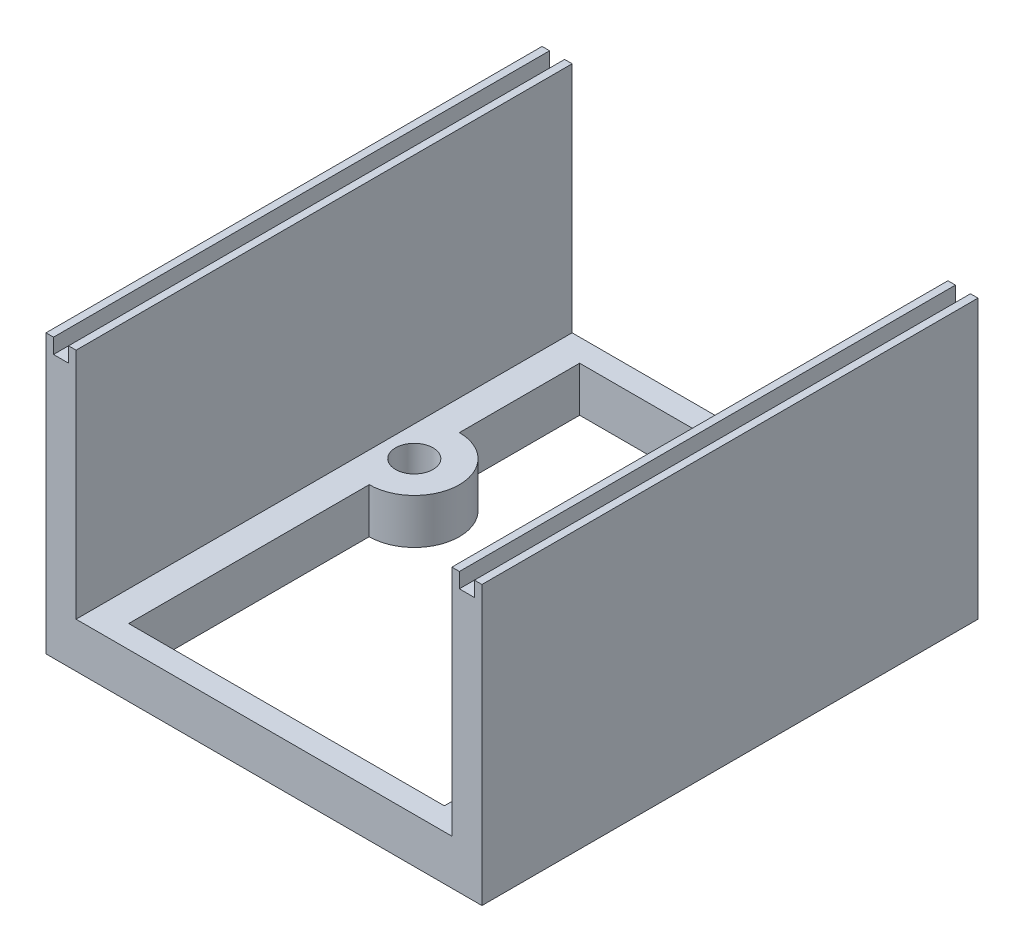
ISO-10303-21;
HEADER;
FILE_DESCRIPTION(('STEP AP214'),'2;1');
FILE_NAME('part.step','',(''),(''),'','','');
FILE_SCHEMA(('AUTOMOTIVE_DESIGN { 1 0 10303 214 1 1 1 1 }'));
ENDSEC;
DATA;
#1=APPLICATION_CONTEXT('core data for automotive mechanical design processes');
#2=APPLICATION_PROTOCOL_DEFINITION('international standard','automotive_design',2000,#1);
#3=PRODUCT_CONTEXT('',#1,'mechanical');
#4=PRODUCT('Part','Part','',(#3));
#5=PRODUCT_RELATED_PRODUCT_CATEGORY('part','',(#4));
#6=PRODUCT_DEFINITION_FORMATION('','',#4);
#7=PRODUCT_DEFINITION_CONTEXT('part definition',#1,'design');
#8=PRODUCT_DEFINITION('design','',#6,#7);
#9=PRODUCT_DEFINITION_SHAPE('','',#8);
#10=(LENGTH_UNIT() NAMED_UNIT(*) SI_UNIT(.MILLI.,.METRE.));
#11=(NAMED_UNIT(*) PLANE_ANGLE_UNIT() SI_UNIT($,.RADIAN.));
#12=(NAMED_UNIT(*) SI_UNIT($,.STERADIAN.) SOLID_ANGLE_UNIT());
#13=UNCERTAINTY_MEASURE_WITH_UNIT(LENGTH_MEASURE(1.E-05),#10,'distance_accuracy_value','');
#14=(GEOMETRIC_REPRESENTATION_CONTEXT(3) GLOBAL_UNCERTAINTY_ASSIGNED_CONTEXT((#13)) GLOBAL_UNIT_ASSIGNED_CONTEXT((#10,
#11,#12)) REPRESENTATION_CONTEXT('',''));
#15=CARTESIAN_POINT('',(0.,0.,0.));
#16=DIRECTION('',(0.,0.,1.));
#17=DIRECTION('',(1.,0.,0.));
#18=AXIS2_PLACEMENT_3D('',#15,#16,#17);
#19=CARTESIAN_POINT('',(0.,18.5,0.));
#20=DIRECTION('',(0.,1.,0.));
#21=DIRECTION('',(0.,0.,1.));
#22=AXIS2_PLACEMENT_3D('',#19,#20,#21);
#23=PLANE('',#22);
#24=DIRECTION('',(0.,0.,1.));
#25=VECTOR('',#24,1.);
#26=CARTESIAN_POINT('',(13.,18.5,-16.5));
#27=LINE('',#26,#25);
#28=CARTESIAN_POINT('',(13.,18.5,-16.5));
#29=VERTEX_POINT('',#28);
#30=CARTESIAN_POINT('',(13.,18.5,16.5));
#31=VERTEX_POINT('',#30);
#32=EDGE_CURVE('E213',#29,#31,#27,.T.);
#33=ORIENTED_EDGE('',*,*,#32,.F.);
#34=DIRECTION('',(-1.,0.,0.));
#35=VECTOR('',#34,1.);
#36=CARTESIAN_POINT('',(14.5,18.5,-16.5));
#37=LINE('',#36,#35);
#38=CARTESIAN_POINT('',(12.5,18.5,-16.5));
#39=VERTEX_POINT('',#38);
#40=EDGE_CURVE('E339',#29,#39,#37,.T.);
#41=ORIENTED_EDGE('',*,*,#40,.T.);
#42=DIRECTION('',(0.,0.,1.));
#43=VECTOR('',#42,1.);
#44=CARTESIAN_POINT('',(12.5,18.5,16.5));
#45=LINE('',#44,#43);
#46=CARTESIAN_POINT('',(12.5,18.5,16.5));
#47=VERTEX_POINT('',#46);
#48=EDGE_CURVE('E336',#39,#47,#45,.T.);
#49=ORIENTED_EDGE('',*,*,#48,.T.);
#50=DIRECTION('',(1.,0.,0.));
#51=VECTOR('',#50,1.);
#52=CARTESIAN_POINT('',(14.5,18.5,16.5));
#53=LINE('',#52,#51);
#54=EDGE_CURVE('E333',#47,#31,#53,.T.);
#55=ORIENTED_EDGE('',*,*,#54,.T.);
#56=EDGE_LOOP('',(#33,#41,#49,#55));
#57=FACE_BOUND('',#56,.T.);
#58=ADVANCED_FACE('F45',(#57),#23,.T.);
#59=CARTESIAN_POINT('',(0.,18.5,0.));
#60=DIRECTION('',(0.,1.,0.));
#61=DIRECTION('',(0.,0.,1.));
#62=AXIS2_PLACEMENT_3D('',#59,#60,#61);
#63=PLANE('',#62);
#64=DIRECTION('',(0.,0.,1.));
#65=VECTOR('',#64,1.);
#66=CARTESIAN_POINT('',(-14.,18.5,-16.5));
#67=LINE('',#66,#65);
#68=CARTESIAN_POINT('',(-14.,18.5,-16.5));
#69=VERTEX_POINT('',#68);
#70=CARTESIAN_POINT('',(-14.,18.5,16.5));
#71=VERTEX_POINT('',#70);
#72=EDGE_CURVE('E243',#69,#71,#67,.T.);
#73=ORIENTED_EDGE('',*,*,#72,.F.);
#74=DIRECTION('',(-1.,0.,0.));
#75=VECTOR('',#74,1.);
#76=CARTESIAN_POINT('',(-14.5,18.5,-16.5));
#77=LINE('',#76,#75);
#78=CARTESIAN_POINT('',(-14.5,18.5,-16.5));
#79=VERTEX_POINT('',#78);
#80=EDGE_CURVE('E303',#69,#79,#77,.T.);
#81=ORIENTED_EDGE('',*,*,#80,.T.);
#82=DIRECTION('',(0.,0.,1.));
#83=VECTOR('',#82,1.);
#84=CARTESIAN_POINT('',(-14.5,18.5,-16.5));
#85=LINE('',#84,#83);
#86=CARTESIAN_POINT('',(-14.5,18.5,16.5));
#87=VERTEX_POINT('',#86);
#88=EDGE_CURVE('E290',#79,#87,#85,.T.);
#89=ORIENTED_EDGE('',*,*,#88,.T.);
#90=DIRECTION('',(1.,0.,0.));
#91=VECTOR('',#90,1.);
#92=CARTESIAN_POINT('',(-14.5,18.5,16.5));
#93=LINE('',#92,#91);
#94=EDGE_CURVE('E296',#87,#71,#93,.T.);
#95=ORIENTED_EDGE('',*,*,#94,.T.);
#96=EDGE_LOOP('',(#73,#81,#89,#95));
#97=FACE_BOUND('',#96,.T.);
#98=ADVANCED_FACE('F496',(#97),#63,.T.);
#99=CARTESIAN_POINT('',(0.,3.,0.));
#100=DIRECTION('',(0.,-1.,0.));
#101=DIRECTION('',(0.,0.,-1.));
#102=AXIS2_PLACEMENT_3D('',#99,#100,#101);
#103=PLANE('',#102);
#104=CARTESIAN_POINT('',(-10.5,3.,-4.));
#105=DIRECTION('',(0.,1.,0.));
#106=DIRECTION('',(0.,0.,1.));
#107=AXIS2_PLACEMENT_3D('',#104,#105,#106);
#108=CIRCLE('',#107,1.25);
#109=CARTESIAN_POINT('',(-10.5,3.,-2.75));
#110=VERTEX_POINT('',#109);
#111=EDGE_CURVE('E374',#110,#110,#108,.T.);
#112=ORIENTED_EDGE('',*,*,#111,.F.);
#113=EDGE_LOOP('',(#112));
#114=FACE_BOUND('',#113,.T.);
#115=CARTESIAN_POINT('',(10.5,3.,-4.));
#116=DIRECTION('',(0.,1.,0.));
#117=DIRECTION('',(0.,0.,1.));
#118=AXIS2_PLACEMENT_3D('',#115,#116,#117);
#119=CIRCLE('',#118,1.25);
#120=CARTESIAN_POINT('',(10.5,3.,-2.75));
#121=VERTEX_POINT('',#120);
#122=EDGE_CURVE('E378',#121,#121,#119,.T.);
#123=ORIENTED_EDGE('',*,*,#122,.F.);
#124=EDGE_LOOP('',(#123));
#125=FACE_BOUND('',#124,.T.);
#126=DIRECTION('',(-1.,0.,0.));
#127=VECTOR('',#126,1.);
#128=CARTESIAN_POINT('',(-10.5,3.,-15.));
#129=LINE('',#128,#127);
#130=CARTESIAN_POINT('',(10.5,3.,-15.));
#131=VERTEX_POINT('',#130);
#132=CARTESIAN_POINT('',(-10.5,3.,-15.));
#133=VERTEX_POINT('',#132);
#134=EDGE_CURVE('E385',#131,#133,#129,.T.);
#135=ORIENTED_EDGE('',*,*,#134,.F.);
#136=DIRECTION('',(0.,0.,-1.));
#137=VECTOR('',#136,1.);
#138=CARTESIAN_POINT('',(10.5,3.,-7.));
#139=LINE('',#138,#137);
#140=CARTESIAN_POINT('',(10.5,3.,-7.));
#141=VERTEX_POINT('',#140);
#142=EDGE_CURVE('E408',#141,#131,#139,.T.);
#143=ORIENTED_EDGE('',*,*,#142,.F.);
#144=CARTESIAN_POINT('',(10.5,3.,-4.));
#145=DIRECTION('',(0.,-1.,0.));
#146=DIRECTION('',(0.,0.,1.));
#147=AXIS2_PLACEMENT_3D('',#144,#145,#146);
#148=CIRCLE('',#147,3.);
#149=CARTESIAN_POINT('',(10.5,3.,-0.999999999999999));
#150=VERTEX_POINT('',#149);
#151=EDGE_CURVE('E404',#150,#141,#148,.T.);
#152=ORIENTED_EDGE('',*,*,#151,.F.);
#153=DIRECTION('',(0.,0.,-1.));
#154=VECTOR('',#153,1.);
#155=CARTESIAN_POINT('',(10.5,3.,15.));
#156=LINE('',#155,#154);
#157=CARTESIAN_POINT('',(10.5,3.,15.));
#158=VERTEX_POINT('',#157);
#159=EDGE_CURVE('E401',#158,#150,#156,.T.);
#160=ORIENTED_EDGE('',*,*,#159,.F.);
#161=DIRECTION('',(1.,0.,0.));
#162=VECTOR('',#161,1.);
#163=CARTESIAN_POINT('',(-10.5,3.,15.));
#164=LINE('',#163,#162);
#165=CARTESIAN_POINT('',(-10.5,3.,15.));
#166=VERTEX_POINT('',#165);
#167=EDGE_CURVE('E398',#166,#158,#164,.T.);
#168=ORIENTED_EDGE('',*,*,#167,.F.);
#169=DIRECTION('',(0.,0.,1.));
#170=VECTOR('',#169,1.);
#171=CARTESIAN_POINT('',(-10.5,3.,15.));
#172=LINE('',#171,#170);
#173=CARTESIAN_POINT('',(-10.5,3.,-1.));
#174=VERTEX_POINT('',#173);
#175=EDGE_CURVE('E395',#174,#166,#172,.T.);
#176=ORIENTED_EDGE('',*,*,#175,.F.);
#177=CARTESIAN_POINT('',(-10.5,3.,-4.));
#178=DIRECTION('',(0.,-1.,0.));
#179=DIRECTION('',(0.,0.,1.));
#180=AXIS2_PLACEMENT_3D('',#177,#178,#179);
#181=CIRCLE('',#180,3.);
#182=CARTESIAN_POINT('',(-10.5,3.,-7.));
#183=VERTEX_POINT('',#182);
#184=EDGE_CURVE('E392',#183,#174,#181,.T.);
#185=ORIENTED_EDGE('',*,*,#184,.F.);
#186=DIRECTION('',(0.,0.,1.));
#187=VECTOR('',#186,1.);
#188=CARTESIAN_POINT('',(-10.5,3.,-7.));
#189=LINE('',#188,#187);
#190=EDGE_CURVE('E388',#133,#183,#189,.T.);
#191=ORIENTED_EDGE('',*,*,#190,.F.);
#192=EDGE_LOOP('',(#135,#143,#152,#160,#168,#176,#185,#191));
#193=FACE_BOUND('',#192,.T.);
#194=DIRECTION('',(0.,0.,-1.));
#195=VECTOR('',#194,1.);
#196=CARTESIAN_POINT('',(-12.5,3.,-16.5));
#197=LINE('',#196,#195);
#198=CARTESIAN_POINT('',(-12.5,3.,16.5));
#199=VERTEX_POINT('',#198);
#200=CARTESIAN_POINT('',(-12.5,3.,-16.5));
#201=VERTEX_POINT('',#200);
#202=EDGE_CURVE('E295',#199,#201,#197,.T.);
#203=ORIENTED_EDGE('',*,*,#202,.F.);
#204=DIRECTION('',(1.,0.,0.));
#205=VECTOR('',#204,1.);
#206=CARTESIAN_POINT('',(-12.,3.,16.5));
#207=LINE('',#206,#205);
#208=CARTESIAN_POINT('',(12.5,3.,16.5));
#209=VERTEX_POINT('',#208);
#210=EDGE_CURVE('E11',#199,#209,#207,.T.);
#211=ORIENTED_EDGE('',*,*,#210,.T.);
#212=DIRECTION('',(0.,0.,1.));
#213=VECTOR('',#212,1.);
#214=CARTESIAN_POINT('',(12.5,3.,16.5));
#215=LINE('',#214,#213);
#216=CARTESIAN_POINT('',(12.5,3.,-16.5));
#217=VERTEX_POINT('',#216);
#218=EDGE_CURVE('E312',#217,#209,#215,.T.);
#219=ORIENTED_EDGE('',*,*,#218,.F.);
#220=DIRECTION('',(-1.,0.,0.));
#221=VECTOR('',#220,1.);
#222=CARTESIAN_POINT('',(-12.,3.,-16.5));
#223=LINE('',#222,#221);
#224=EDGE_CURVE('E55',#217,#201,#223,.T.);
#225=ORIENTED_EDGE('',*,*,#224,.T.);
#226=EDGE_LOOP('',(#203,#211,#219,#225));
#227=FACE_BOUND('',#226,.T.);
#228=ADVANCED_FACE('F525',(#114,#125,#193,#227),#103,.F.);
#229=CARTESIAN_POINT('',(0.,0.,0.));
#230=DIRECTION('',(0.,-1.,0.));
#231=DIRECTION('',(0.,0.,-1.));
#232=AXIS2_PLACEMENT_3D('',#229,#230,#231);
#233=PLANE('',#232);
#234=CARTESIAN_POINT('',(-10.5,0.,-4.));
#235=DIRECTION('',(0.,1.,0.));
#236=DIRECTION('',(0.,0.,1.));
#237=AXIS2_PLACEMENT_3D('',#234,#235,#236);
#238=CIRCLE('',#237,1.25);
#239=CARTESIAN_POINT('',(-10.5,0.,-2.75));
#240=VERTEX_POINT('',#239);
#241=EDGE_CURVE('E369',#240,#240,#238,.T.);
#242=ORIENTED_EDGE('',*,*,#241,.T.);
#243=EDGE_LOOP('',(#242));
#244=FACE_BOUND('',#243,.T.);
#245=CARTESIAN_POINT('',(10.5,0.,-4.));
#246=DIRECTION('',(0.,1.,0.));
#247=DIRECTION('',(0.,0.,1.));
#248=AXIS2_PLACEMENT_3D('',#245,#246,#247);
#249=CIRCLE('',#248,1.25);
#250=CARTESIAN_POINT('',(10.5,0.,-2.75));
#251=VERTEX_POINT('',#250);
#252=EDGE_CURVE('E356',#251,#251,#249,.T.);
#253=ORIENTED_EDGE('',*,*,#252,.T.);
#254=EDGE_LOOP('',(#253));
#255=FACE_BOUND('',#254,.T.);
#256=DIRECTION('',(-1.,0.,0.));
#257=VECTOR('',#256,1.);
#258=CARTESIAN_POINT('',(-12.,0.,-16.5));
#259=LINE('',#258,#257);
#260=CARTESIAN_POINT('',(14.5,0.,-16.5));
#261=VERTEX_POINT('',#260);
#262=CARTESIAN_POINT('',(-14.5,0.,-16.5));
#263=VERTEX_POINT('',#262);
#264=EDGE_CURVE('E467',#261,#263,#259,.T.);
#265=ORIENTED_EDGE('',*,*,#264,.F.);
#266=DIRECTION('',(0.,0.,-1.));
#267=VECTOR('',#266,1.);
#268=CARTESIAN_POINT('',(14.5,0.,-16.5));
#269=LINE('',#268,#267);
#270=CARTESIAN_POINT('',(14.5,0.,16.5));
#271=VERTEX_POINT('',#270);
#272=EDGE_CURVE('E352',#271,#261,#269,.T.);
#273=ORIENTED_EDGE('',*,*,#272,.F.);
#274=DIRECTION('',(1.,0.,0.));
#275=VECTOR('',#274,1.);
#276=CARTESIAN_POINT('',(-12.,0.,16.5));
#277=LINE('',#276,#275);
#278=CARTESIAN_POINT('',(-14.5,0.,16.5));
#279=VERTEX_POINT('',#278);
#280=EDGE_CURVE('E49',#279,#271,#277,.T.);
#281=ORIENTED_EDGE('',*,*,#280,.F.);
#282=DIRECTION('',(0.,0.,1.));
#283=VECTOR('',#282,1.);
#284=CARTESIAN_POINT('',(-14.5,0.,16.5));
#285=LINE('',#284,#283);
#286=EDGE_CURVE('E347',#263,#279,#285,.T.);
#287=ORIENTED_EDGE('',*,*,#286,.F.);
#288=EDGE_LOOP('',(#265,#273,#281,#287));
#289=FACE_BOUND('',#288,.T.);
#290=DIRECTION('',(0.,0.,-1.));
#291=VECTOR('',#290,1.);
#292=CARTESIAN_POINT('',(10.5,0.,-7.));
#293=LINE('',#292,#291);
#294=CARTESIAN_POINT('',(10.5,0.,-7.));
#295=VERTEX_POINT('',#294);
#296=CARTESIAN_POINT('',(10.5,0.,-15.));
#297=VERTEX_POINT('',#296);
#298=EDGE_CURVE('E389',#295,#297,#293,.T.);
#299=ORIENTED_EDGE('',*,*,#298,.T.);
#300=DIRECTION('',(-1.,0.,0.));
#301=VECTOR('',#300,1.);
#302=CARTESIAN_POINT('',(-10.5,0.,-15.));
#303=LINE('',#302,#301);
#304=CARTESIAN_POINT('',(-10.5,0.,-15.));
#305=VERTEX_POINT('',#304);
#306=EDGE_CURVE('E373',#297,#305,#303,.T.);
#307=ORIENTED_EDGE('',*,*,#306,.T.);
#308=DIRECTION('',(0.,0.,1.));
#309=VECTOR('',#308,1.);
#310=CARTESIAN_POINT('',(-10.5,0.,-7.));
#311=LINE('',#310,#309);
#312=CARTESIAN_POINT('',(-10.5,0.,-7.));
#313=VERTEX_POINT('',#312);
#314=EDGE_CURVE('E415',#305,#313,#311,.T.);
#315=ORIENTED_EDGE('',*,*,#314,.T.);
#316=CARTESIAN_POINT('',(-10.5,0.,-4.));
#317=DIRECTION('',(0.,-1.,0.));
#318=DIRECTION('',(0.,0.,1.));
#319=AXIS2_PLACEMENT_3D('',#316,#317,#318);
#320=CIRCLE('',#319,3.);
#321=CARTESIAN_POINT('',(-10.5,0.,-1.));
#322=VERTEX_POINT('',#321);
#323=EDGE_CURVE('E419',#313,#322,#320,.T.);
#324=ORIENTED_EDGE('',*,*,#323,.T.);
#325=DIRECTION('',(0.,0.,1.));
#326=VECTOR('',#325,1.);
#327=CARTESIAN_POINT('',(-10.5,0.,15.));
#328=LINE('',#327,#326);
#329=CARTESIAN_POINT('',(-10.5,0.,15.));
#330=VERTEX_POINT('',#329);
#331=EDGE_CURVE('E423',#322,#330,#328,.T.);
#332=ORIENTED_EDGE('',*,*,#331,.T.);
#333=DIRECTION('',(1.,0.,0.));
#334=VECTOR('',#333,1.);
#335=CARTESIAN_POINT('',(-10.5,0.,15.));
#336=LINE('',#335,#334);
#337=CARTESIAN_POINT('',(10.5,0.,15.));
#338=VERTEX_POINT('',#337);
#339=EDGE_CURVE('E427',#330,#338,#336,.T.);
#340=ORIENTED_EDGE('',*,*,#339,.T.);
#341=DIRECTION('',(0.,0.,-1.));
#342=VECTOR('',#341,1.);
#343=CARTESIAN_POINT('',(10.5,0.,15.));
#344=LINE('',#343,#342);
#345=CARTESIAN_POINT('',(10.5,0.,-0.999999999999999));
#346=VERTEX_POINT('',#345);
#347=EDGE_CURVE('E431',#338,#346,#344,.T.);
#348=ORIENTED_EDGE('',*,*,#347,.T.);
#349=CARTESIAN_POINT('',(10.5,0.,-4.));
#350=DIRECTION('',(0.,-1.,0.));
#351=DIRECTION('',(0.,0.,1.));
#352=AXIS2_PLACEMENT_3D('',#349,#350,#351);
#353=CIRCLE('',#352,3.);
#354=EDGE_CURVE('E435',#346,#295,#353,.T.);
#355=ORIENTED_EDGE('',*,*,#354,.T.);
#356=EDGE_LOOP('',(#299,#307,#315,#324,#332,#340,#348,#355));
#357=FACE_BOUND('',#356,.T.);
#358=ADVANCED_FACE('F483',(#244,#255,#289,#357),#233,.T.);
#359=CARTESIAN_POINT('',(-12.,3.,-16.5));
#360=DIRECTION('',(0.,0.,1.));
#361=DIRECTION('',(1.,0.,0.));
#362=AXIS2_PLACEMENT_3D('',#359,#360,#361);
#363=PLANE('',#362);
#364=ORIENTED_EDGE('',*,*,#40,.F.);
#365=DIRECTION('',(0.,1.,0.));
#366=VECTOR('',#365,1.);
#367=CARTESIAN_POINT('',(13.,17.5,-16.5));
#368=LINE('',#367,#366);
#369=CARTESIAN_POINT('',(13.,17.5,-16.5));
#370=VERTEX_POINT('',#369);
#371=EDGE_CURVE('E246',#370,#29,#368,.T.);
#372=ORIENTED_EDGE('',*,*,#371,.F.);
#373=DIRECTION('',(-1.,0.,0.));
#374=VECTOR('',#373,1.);
#375=CARTESIAN_POINT('',(13.,17.5,-16.5));
#376=LINE('',#375,#374);
#377=CARTESIAN_POINT('',(14.,17.5,-16.5));
#378=VERTEX_POINT('',#377);
#379=EDGE_CURVE('E219',#378,#370,#376,.T.);
#380=ORIENTED_EDGE('',*,*,#379,.F.);
#381=DIRECTION('',(0.,1.,0.));
#382=VECTOR('',#381,1.);
#383=CARTESIAN_POINT('',(14.,17.5,-16.5));
#384=LINE('',#383,#382);
#385=CARTESIAN_POINT('',(14.,18.5,-16.5));
#386=VERTEX_POINT('',#385);
#387=EDGE_CURVE('E250',#378,#386,#384,.T.);
#388=ORIENTED_EDGE('',*,*,#387,.T.);
#389=CARTESIAN_POINT('',(14.5,18.5,-16.5));
#390=VERTEX_POINT('',#389);
#391=EDGE_CURVE('E340',#390,#386,#37,.T.);
#392=ORIENTED_EDGE('',*,*,#391,.F.);
#393=DIRECTION('',(0.,1.,0.));
#394=VECTOR('',#393,1.);
#395=CARTESIAN_POINT('',(14.5,0.,-16.5));
#396=LINE('',#395,#394);
#397=EDGE_CURVE('E320',#261,#390,#396,.T.);
#398=ORIENTED_EDGE('',*,*,#397,.F.);
#399=ORIENTED_EDGE('',*,*,#264,.T.);
#400=DIRECTION('',(0.,1.,0.));
#401=VECTOR('',#400,1.);
#402=CARTESIAN_POINT('',(-14.5,0.,-16.5));
#403=LINE('',#402,#401);
#404=EDGE_CURVE('E351',#263,#79,#403,.T.);
#405=ORIENTED_EDGE('',*,*,#404,.T.);
#406=ORIENTED_EDGE('',*,*,#80,.F.);
#407=DIRECTION('',(0.,1.,0.));
#408=VECTOR('',#407,1.);
#409=CARTESIAN_POINT('',(-14.,17.5,-16.5));
#410=LINE('',#409,#408);
#411=CARTESIAN_POINT('',(-14.,17.5,-16.5));
#412=VERTEX_POINT('',#411);
#413=EDGE_CURVE('E267',#412,#69,#410,.T.);
#414=ORIENTED_EDGE('',*,*,#413,.F.);
#415=DIRECTION('',(-1.,0.,0.));
#416=VECTOR('',#415,1.);
#417=CARTESIAN_POINT('',(-14.,17.5,-16.5));
#418=LINE('',#417,#416);
#419=CARTESIAN_POINT('',(-13.,17.5,-16.5));
#420=VERTEX_POINT('',#419);
#421=EDGE_CURVE('E260',#420,#412,#418,.T.);
#422=ORIENTED_EDGE('',*,*,#421,.F.);
#423=DIRECTION('',(0.,1.,0.));
#424=VECTOR('',#423,1.);
#425=CARTESIAN_POINT('',(-13.,17.5,-16.5));
#426=LINE('',#425,#424);
#427=CARTESIAN_POINT('',(-13.,18.5,-16.5));
#428=VERTEX_POINT('',#427);
#429=EDGE_CURVE('E263',#420,#428,#426,.T.);
#430=ORIENTED_EDGE('',*,*,#429,.T.);
#431=CARTESIAN_POINT('',(-12.5,18.5,-16.5));
#432=VERTEX_POINT('',#431);
#433=EDGE_CURVE('E304',#432,#428,#77,.T.);
#434=ORIENTED_EDGE('',*,*,#433,.F.);
#435=DIRECTION('',(0.,-1.,0.));
#436=VECTOR('',#435,1.);
#437=CARTESIAN_POINT('',(-12.5,18.5,-16.5));
#438=LINE('',#437,#436);
#439=EDGE_CURVE('E308',#432,#201,#438,.T.);
#440=ORIENTED_EDGE('',*,*,#439,.T.);
#441=ORIENTED_EDGE('',*,*,#224,.F.);
#442=DIRECTION('',(0.,-1.,0.));
#443=VECTOR('',#442,1.);
#444=CARTESIAN_POINT('',(12.5,18.5,-16.5));
#445=LINE('',#444,#443);
#446=EDGE_CURVE('E249',#39,#217,#445,.T.);
#447=ORIENTED_EDGE('',*,*,#446,.F.);
#448=EDGE_LOOP('',(#364,#372,#380,#388,#392,#398,#399,#405,#406,#414,#422,#430,#434,#440,#441,#447));
#449=FACE_BOUND('',#448,.T.);
#450=ADVANCED_FACE('F47',(#449),#363,.F.);
#451=CARTESIAN_POINT('',(-12.,3.,16.5));
#452=DIRECTION('',(0.,0.,-1.));
#453=DIRECTION('',(-1.,0.,0.));
#454=AXIS2_PLACEMENT_3D('',#451,#452,#453);
#455=PLANE('',#454);
#456=DIRECTION('',(1.,0.,0.));
#457=VECTOR('',#456,1.);
#458=CARTESIAN_POINT('',(13.,17.5,16.5));
#459=LINE('',#458,#457);
#460=CARTESIAN_POINT('',(13.,17.5,16.5));
#461=VERTEX_POINT('',#460);
#462=CARTESIAN_POINT('',(14.,17.5,16.5));
#463=VERTEX_POINT('',#462);
#464=EDGE_CURVE('E225',#461,#463,#459,.T.);
#465=ORIENTED_EDGE('',*,*,#464,.F.);
#466=DIRECTION('',(0.,1.,0.));
#467=VECTOR('',#466,1.);
#468=CARTESIAN_POINT('',(13.,17.5,16.5));
#469=LINE('',#468,#467);
#470=EDGE_CURVE('E207',#461,#31,#469,.T.);
#471=ORIENTED_EDGE('',*,*,#470,.T.);
#472=ORIENTED_EDGE('',*,*,#54,.F.);
#473=DIRECTION('',(0.,-1.,0.));
#474=VECTOR('',#473,1.);
#475=CARTESIAN_POINT('',(12.5,18.5,16.5));
#476=LINE('',#475,#474);
#477=EDGE_CURVE('E324',#47,#209,#476,.T.);
#478=ORIENTED_EDGE('',*,*,#477,.T.);
#479=ORIENTED_EDGE('',*,*,#210,.F.);
#480=DIRECTION('',(0.,-1.,0.));
#481=VECTOR('',#480,1.);
#482=CARTESIAN_POINT('',(-12.5,18.5,16.5));
#483=LINE('',#482,#481);
#484=CARTESIAN_POINT('',(-12.5,18.5,16.5));
#485=VERTEX_POINT('',#484);
#486=EDGE_CURVE('E316',#485,#199,#483,.T.);
#487=ORIENTED_EDGE('',*,*,#486,.F.);
#488=CARTESIAN_POINT('',(-13.,18.5,16.5));
#489=VERTEX_POINT('',#488);
#490=EDGE_CURVE('E294',#489,#485,#93,.T.);
#491=ORIENTED_EDGE('',*,*,#490,.F.);
#492=DIRECTION('',(0.,1.,0.));
#493=VECTOR('',#492,1.);
#494=CARTESIAN_POINT('',(-13.,17.5,16.5));
#495=LINE('',#494,#493);
#496=CARTESIAN_POINT('',(-13.,17.5,16.5));
#497=VERTEX_POINT('',#496);
#498=EDGE_CURVE('E71',#497,#489,#495,.T.);
#499=ORIENTED_EDGE('',*,*,#498,.F.);
#500=DIRECTION('',(1.,0.,0.));
#501=VECTOR('',#500,1.);
#502=CARTESIAN_POINT('',(-14.,17.5,16.5));
#503=LINE('',#502,#501);
#504=CARTESIAN_POINT('',(-14.,17.5,16.5));
#505=VERTEX_POINT('',#504);
#506=EDGE_CURVE('E283',#505,#497,#503,.T.);
#507=ORIENTED_EDGE('',*,*,#506,.F.);
#508=DIRECTION('',(0.,1.,0.));
#509=VECTOR('',#508,1.);
#510=CARTESIAN_POINT('',(-14.,17.5,16.5));
#511=LINE('',#510,#509);
#512=EDGE_CURVE('E256',#505,#71,#511,.T.);
#513=ORIENTED_EDGE('',*,*,#512,.T.);
#514=ORIENTED_EDGE('',*,*,#94,.F.);
#515=DIRECTION('',(0.,1.,0.));
#516=VECTOR('',#515,1.);
#517=CARTESIAN_POINT('',(-14.5,0.,16.5));
#518=LINE('',#517,#516);
#519=EDGE_CURVE('E353',#279,#87,#518,.T.);
#520=ORIENTED_EDGE('',*,*,#519,.F.);
#521=ORIENTED_EDGE('',*,*,#280,.T.);
#522=DIRECTION('',(0.,1.,0.));
#523=VECTOR('',#522,1.);
#524=CARTESIAN_POINT('',(14.5,0.,16.5));
#525=LINE('',#524,#523);
#526=CARTESIAN_POINT('',(14.5,18.5,16.5));
#527=VERTEX_POINT('',#526);
#528=EDGE_CURVE('E360',#271,#527,#525,.T.);
#529=ORIENTED_EDGE('',*,*,#528,.T.);
#530=CARTESIAN_POINT('',(14.,18.5,16.5));
#531=VERTEX_POINT('',#530);
#532=EDGE_CURVE('E328',#531,#527,#53,.T.);
#533=ORIENTED_EDGE('',*,*,#532,.F.);
#534=DIRECTION('',(0.,1.,0.));
#535=VECTOR('',#534,1.);
#536=CARTESIAN_POINT('',(14.,17.5,16.5));
#537=LINE('',#536,#535);
#538=EDGE_CURVE('E63',#463,#531,#537,.T.);
#539=ORIENTED_EDGE('',*,*,#538,.F.);
#540=EDGE_LOOP('',(#465,#471,#472,#478,#479,#487,#491,#499,#507,#513,#514,#520,#521,#529,#533,#539));
#541=FACE_BOUND('',#540,.T.);
#542=ADVANCED_FACE('F231',(#541),#455,.F.);
#543=CARTESIAN_POINT('',(-10.5,3.,-15.));
#544=DIRECTION('',(0.,0.,1.));
#545=DIRECTION('',(1.,0.,0.));
#546=AXIS2_PLACEMENT_3D('',#543,#544,#545);
#547=PLANE('',#546);
#548=ORIENTED_EDGE('',*,*,#306,.F.);
#549=DIRECTION('',(0.,-1.,0.));
#550=VECTOR('',#549,1.);
#551=CARTESIAN_POINT('',(10.5,3.,-15.));
#552=LINE('',#551,#550);
#553=EDGE_CURVE('E411',#131,#297,#552,.T.);
#554=ORIENTED_EDGE('',*,*,#553,.F.);
#555=ORIENTED_EDGE('',*,*,#134,.T.);
#556=DIRECTION('',(0.,-1.,0.));
#557=VECTOR('',#556,1.);
#558=CARTESIAN_POINT('',(-10.5,3.,-15.));
#559=LINE('',#558,#557);
#560=EDGE_CURVE('E463',#133,#305,#559,.T.);
#561=ORIENTED_EDGE('',*,*,#560,.T.);
#562=EDGE_LOOP('',(#548,#554,#555,#561));
#563=FACE_BOUND('',#562,.T.);
#564=ADVANCED_FACE('F637',(#563),#547,.T.);
#565=CARTESIAN_POINT('',(-10.5,3.,-7.));
#566=DIRECTION('',(1.,0.,0.));
#567=DIRECTION('',(0.,0.,-1.));
#568=AXIS2_PLACEMENT_3D('',#565,#566,#567);
#569=PLANE('',#568);
#570=ORIENTED_EDGE('',*,*,#314,.F.);
#571=ORIENTED_EDGE('',*,*,#560,.F.);
#572=ORIENTED_EDGE('',*,*,#190,.T.);
#573=DIRECTION('',(0.,-1.,0.));
#574=VECTOR('',#573,1.);
#575=CARTESIAN_POINT('',(-10.5,3.,-7.));
#576=LINE('',#575,#574);
#577=EDGE_CURVE('E460',#183,#313,#576,.T.);
#578=ORIENTED_EDGE('',*,*,#577,.T.);
#579=EDGE_LOOP('',(#570,#571,#572,#578));
#580=FACE_BOUND('',#579,.T.);
#581=ADVANCED_FACE('F746',(#580),#569,.T.);
#582=CARTESIAN_POINT('',(-10.5,3.,-4.));
#583=DIRECTION('',(0.,-1.,0.));
#584=DIRECTION('',(0.,0.,-1.));
#585=AXIS2_PLACEMENT_3D('',#582,#583,#584);
#586=CYLINDRICAL_SURFACE('',#585,3.);
#587=ORIENTED_EDGE('',*,*,#323,.F.);
#588=ORIENTED_EDGE('',*,*,#577,.F.);
#589=ORIENTED_EDGE('',*,*,#184,.T.);
#590=DIRECTION('',(0.,-1.,0.));
#591=VECTOR('',#590,1.);
#592=CARTESIAN_POINT('',(-10.5,3.,-1.));
#593=LINE('',#592,#591);
#594=EDGE_CURVE('E457',#174,#322,#593,.T.);
#595=ORIENTED_EDGE('',*,*,#594,.T.);
#596=EDGE_LOOP('',(#587,#588,#589,#595));
#597=FACE_BOUND('',#596,.T.);
#598=ADVANCED_FACE('F737',(#597),#586,.T.);
#599=CARTESIAN_POINT('',(-10.5,3.,15.));
#600=DIRECTION('',(1.,0.,0.));
#601=DIRECTION('',(0.,0.,-1.));
#602=AXIS2_PLACEMENT_3D('',#599,#600,#601);
#603=PLANE('',#602);
#604=ORIENTED_EDGE('',*,*,#331,.F.);
#605=ORIENTED_EDGE('',*,*,#594,.F.);
#606=ORIENTED_EDGE('',*,*,#175,.T.);
#607=DIRECTION('',(0.,-1.,0.));
#608=VECTOR('',#607,1.);
#609=CARTESIAN_POINT('',(-10.5,3.,15.));
#610=LINE('',#609,#608);
#611=EDGE_CURVE('E454',#166,#330,#610,.T.);
#612=ORIENTED_EDGE('',*,*,#611,.T.);
#613=EDGE_LOOP('',(#604,#605,#606,#612));
#614=FACE_BOUND('',#613,.T.);
#615=ADVANCED_FACE('F728',(#614),#603,.T.);
#616=CARTESIAN_POINT('',(-10.5,3.,15.));
#617=DIRECTION('',(0.,0.,-1.));
#618=DIRECTION('',(-1.,0.,0.));
#619=AXIS2_PLACEMENT_3D('',#616,#617,#618);
#620=PLANE('',#619);
#621=ORIENTED_EDGE('',*,*,#339,.F.);
#622=ORIENTED_EDGE('',*,*,#611,.F.);
#623=ORIENTED_EDGE('',*,*,#167,.T.);
#624=DIRECTION('',(0.,-1.,0.));
#625=VECTOR('',#624,1.);
#626=CARTESIAN_POINT('',(10.5,3.,15.));
#627=LINE('',#626,#625);
#628=EDGE_CURVE('E451',#158,#338,#627,.T.);
#629=ORIENTED_EDGE('',*,*,#628,.T.);
#630=EDGE_LOOP('',(#621,#622,#623,#629));
#631=FACE_BOUND('',#630,.T.);
#632=ADVANCED_FACE('F719',(#631),#620,.T.);
#633=CARTESIAN_POINT('',(10.5,3.,15.));
#634=DIRECTION('',(-1.,0.,0.));
#635=DIRECTION('',(0.,0.,1.));
#636=AXIS2_PLACEMENT_3D('',#633,#634,#635);
#637=PLANE('',#636);
#638=ORIENTED_EDGE('',*,*,#347,.F.);
#639=ORIENTED_EDGE('',*,*,#628,.F.);
#640=ORIENTED_EDGE('',*,*,#159,.T.);
#641=DIRECTION('',(0.,-1.,0.));
#642=VECTOR('',#641,1.);
#643=CARTESIAN_POINT('',(10.5,3.,-0.999999999999999));
#644=LINE('',#643,#642);
#645=EDGE_CURVE('E448',#150,#346,#644,.T.);
#646=ORIENTED_EDGE('',*,*,#645,.T.);
#647=EDGE_LOOP('',(#638,#639,#640,#646));
#648=FACE_BOUND('',#647,.T.);
#649=ADVANCED_FACE('F710',(#648),#637,.T.);
#650=CARTESIAN_POINT('',(10.5,3.,-4.));
#651=DIRECTION('',(0.,-1.,0.));
#652=DIRECTION('',(0.,0.,-1.));
#653=AXIS2_PLACEMENT_3D('',#650,#651,#652);
#654=CYLINDRICAL_SURFACE('',#653,3.);
#655=ORIENTED_EDGE('',*,*,#354,.F.);
#656=ORIENTED_EDGE('',*,*,#645,.F.);
#657=ORIENTED_EDGE('',*,*,#151,.T.);
#658=DIRECTION('',(0.,-1.,0.));
#659=VECTOR('',#658,1.);
#660=CARTESIAN_POINT('',(10.5,3.,-7.));
#661=LINE('',#660,#659);
#662=EDGE_CURVE('E445',#141,#295,#661,.T.);
#663=ORIENTED_EDGE('',*,*,#662,.T.);
#664=EDGE_LOOP('',(#655,#656,#657,#663));
#665=FACE_BOUND('',#664,.T.);
#666=ADVANCED_FACE('F701',(#665),#654,.T.);
#667=CARTESIAN_POINT('',(10.5,3.,-7.));
#668=DIRECTION('',(-1.,0.,0.));
#669=DIRECTION('',(0.,0.,1.));
#670=AXIS2_PLACEMENT_3D('',#667,#668,#669);
#671=PLANE('',#670);
#672=ORIENTED_EDGE('',*,*,#298,.F.);
#673=ORIENTED_EDGE('',*,*,#662,.F.);
#674=ORIENTED_EDGE('',*,*,#142,.T.);
#675=ORIENTED_EDGE('',*,*,#553,.T.);
#676=EDGE_LOOP('',(#672,#673,#674,#675));
#677=FACE_BOUND('',#676,.T.);
#678=ADVANCED_FACE('F692',(#677),#671,.T.);
#679=CARTESIAN_POINT('',(10.5,0.,-4.));
#680=DIRECTION('',(0.,1.,0.));
#681=DIRECTION('',(0.,0.,1.));
#682=AXIS2_PLACEMENT_3D('',#679,#680,#681);
#683=CYLINDRICAL_SURFACE('',#682,1.25);
#684=ORIENTED_EDGE('',*,*,#252,.F.);
#685=EDGE_LOOP('',(#684));
#686=FACE_BOUND('',#685,.T.);
#687=ORIENTED_EDGE('',*,*,#122,.T.);
#688=EDGE_LOOP('',(#687));
#689=FACE_BOUND('',#688,.T.);
#690=ADVANCED_FACE('F682',(#686,#689),#683,.F.);
#691=CARTESIAN_POINT('',(-10.5,0.,-4.));
#692=DIRECTION('',(0.,1.,0.));
#693=DIRECTION('',(0.,0.,1.));
#694=AXIS2_PLACEMENT_3D('',#691,#692,#693);
#695=CYLINDRICAL_SURFACE('',#694,1.25);
#696=ORIENTED_EDGE('',*,*,#241,.F.);
#697=EDGE_LOOP('',(#696));
#698=FACE_BOUND('',#697,.T.);
#699=ORIENTED_EDGE('',*,*,#111,.T.);
#700=EDGE_LOOP('',(#699));
#701=FACE_BOUND('',#700,.T.);
#702=ADVANCED_FACE('F648',(#698,#701),#695,.F.);
#703=CARTESIAN_POINT('',(-14.5,0.,16.5));
#704=DIRECTION('',(-1.,0.,0.));
#705=DIRECTION('',(0.,0.,1.));
#706=AXIS2_PLACEMENT_3D('',#703,#704,#705);
#707=PLANE('',#706);
#708=ORIENTED_EDGE('',*,*,#519,.T.);
#709=ORIENTED_EDGE('',*,*,#88,.F.);
#710=ORIENTED_EDGE('',*,*,#404,.F.);
#711=ORIENTED_EDGE('',*,*,#286,.T.);
#712=EDGE_LOOP('',(#708,#709,#710,#711));
#713=FACE_BOUND('',#712,.T.);
#714=ADVANCED_FACE('F500',(#713),#707,.T.);
#715=CARTESIAN_POINT('',(14.5,0.,-16.5));
#716=DIRECTION('',(1.,0.,0.));
#717=DIRECTION('',(0.,0.,-1.));
#718=AXIS2_PLACEMENT_3D('',#715,#716,#717);
#719=PLANE('',#718);
#720=ORIENTED_EDGE('',*,*,#397,.T.);
#721=DIRECTION('',(0.,0.,-1.));
#722=VECTOR('',#721,1.);
#723=CARTESIAN_POINT('',(14.5,18.5,16.5));
#724=LINE('',#723,#722);
#725=EDGE_CURVE('E332',#527,#390,#724,.T.);
#726=ORIENTED_EDGE('',*,*,#725,.F.);
#727=ORIENTED_EDGE('',*,*,#528,.F.);
#728=ORIENTED_EDGE('',*,*,#272,.T.);
#729=EDGE_LOOP('',(#720,#726,#727,#728));
#730=FACE_BOUND('',#729,.T.);
#731=ADVANCED_FACE('F482',(#730),#719,.T.);
#732=CARTESIAN_POINT('',(12.5,18.5,16.5));
#733=DIRECTION('',(1.,0.,0.));
#734=DIRECTION('',(0.,0.,-1.));
#735=AXIS2_PLACEMENT_3D('',#732,#733,#734);
#736=PLANE('',#735);
#737=ORIENTED_EDGE('',*,*,#218,.T.);
#738=ORIENTED_EDGE('',*,*,#477,.F.);
#739=ORIENTED_EDGE('',*,*,#48,.F.);
#740=ORIENTED_EDGE('',*,*,#446,.T.);
#741=EDGE_LOOP('',(#737,#738,#739,#740));
#742=FACE_BOUND('',#741,.T.);
#743=ADVANCED_FACE('F521',(#742),#736,.F.);
#744=DIRECTION('',(0.,0.,-1.));
#745=VECTOR('',#744,1.);
#746=CARTESIAN_POINT('',(14.,18.5,-16.5));
#747=LINE('',#746,#745);
#748=EDGE_CURVE('E229',#531,#386,#747,.T.);
#749=ORIENTED_EDGE('',*,*,#748,.F.);
#750=ORIENTED_EDGE('',*,*,#532,.T.);
#751=ORIENTED_EDGE('',*,*,#725,.T.);
#752=ORIENTED_EDGE('',*,*,#391,.T.);
#753=EDGE_LOOP('',(#749,#750,#751,#752));
#754=FACE_BOUND('',#753,.T.);
#755=ADVANCED_FACE('F488',(#754),#23,.T.);
#756=CARTESIAN_POINT('',(-12.5,18.5,-16.5));
#757=DIRECTION('',(-1.,0.,0.));
#758=DIRECTION('',(0.,0.,1.));
#759=AXIS2_PLACEMENT_3D('',#756,#757,#758);
#760=PLANE('',#759);
#761=ORIENTED_EDGE('',*,*,#202,.T.);
#762=ORIENTED_EDGE('',*,*,#439,.F.);
#763=DIRECTION('',(0.,0.,-1.));
#764=VECTOR('',#763,1.);
#765=CARTESIAN_POINT('',(-12.5,18.5,-16.5));
#766=LINE('',#765,#764);
#767=EDGE_CURVE('E300',#485,#432,#766,.T.);
#768=ORIENTED_EDGE('',*,*,#767,.F.);
#769=ORIENTED_EDGE('',*,*,#486,.T.);
#770=EDGE_LOOP('',(#761,#762,#768,#769));
#771=FACE_BOUND('',#770,.T.);
#772=ADVANCED_FACE('F515',(#771),#760,.F.);
#773=DIRECTION('',(0.,0.,-1.));
#774=VECTOR('',#773,1.);
#775=CARTESIAN_POINT('',(-13.,18.5,-16.5));
#776=LINE('',#775,#774);
#777=EDGE_CURVE('E270',#489,#428,#776,.T.);
#778=ORIENTED_EDGE('',*,*,#777,.F.);
#779=ORIENTED_EDGE('',*,*,#490,.T.);
#780=ORIENTED_EDGE('',*,*,#767,.T.);
#781=ORIENTED_EDGE('',*,*,#433,.T.);
#782=EDGE_LOOP('',(#778,#779,#780,#781));
#783=FACE_BOUND('',#782,.T.);
#784=ADVANCED_FACE('F509',(#783),#63,.T.);
#785=CARTESIAN_POINT('',(-14.,17.5,-16.5));
#786=DIRECTION('',(-1.,0.,0.));
#787=DIRECTION('',(0.,0.,1.));
#788=AXIS2_PLACEMENT_3D('',#785,#786,#787);
#789=PLANE('',#788);
#790=ORIENTED_EDGE('',*,*,#72,.T.);
#791=ORIENTED_EDGE('',*,*,#512,.F.);
#792=DIRECTION('',(0.,0.,1.));
#793=VECTOR('',#792,1.);
#794=CARTESIAN_POINT('',(-14.,17.5,-16.5));
#795=LINE('',#794,#793);
#796=EDGE_CURVE('E273',#412,#505,#795,.T.);
#797=ORIENTED_EDGE('',*,*,#796,.F.);
#798=ORIENTED_EDGE('',*,*,#413,.T.);
#799=EDGE_LOOP('',(#790,#791,#797,#798));
#800=FACE_BOUND('',#799,.T.);
#801=ADVANCED_FACE('F503',(#800),#789,.F.);
#802=CARTESIAN_POINT('',(-13.,17.5,-16.5));
#803=DIRECTION('',(1.,0.,0.));
#804=DIRECTION('',(0.,0.,-1.));
#805=AXIS2_PLACEMENT_3D('',#802,#803,#804);
#806=PLANE('',#805);
#807=ORIENTED_EDGE('',*,*,#777,.T.);
#808=ORIENTED_EDGE('',*,*,#429,.F.);
#809=DIRECTION('',(0.,0.,-1.));
#810=VECTOR('',#809,1.);
#811=CARTESIAN_POINT('',(-13.,17.5,-16.5));
#812=LINE('',#811,#810);
#813=EDGE_CURVE('E279',#497,#420,#812,.T.);
#814=ORIENTED_EDGE('',*,*,#813,.F.);
#815=ORIENTED_EDGE('',*,*,#498,.T.);
#816=EDGE_LOOP('',(#807,#808,#814,#815));
#817=FACE_BOUND('',#816,.T.);
#818=ADVANCED_FACE('F561',(#817),#806,.F.);
#819=CARTESIAN_POINT('',(0.,17.5,0.));
#820=DIRECTION('',(0.,1.,0.));
#821=DIRECTION('',(0.,0.,1.));
#822=AXIS2_PLACEMENT_3D('',#819,#820,#821);
#823=PLANE('',#822);
#824=ORIENTED_EDGE('',*,*,#796,.T.);
#825=ORIENTED_EDGE('',*,*,#506,.T.);
#826=ORIENTED_EDGE('',*,*,#813,.T.);
#827=ORIENTED_EDGE('',*,*,#421,.T.);
#828=EDGE_LOOP('',(#824,#825,#826,#827));
#829=FACE_BOUND('',#828,.T.);
#830=ADVANCED_FACE('F505',(#829),#823,.T.);
#831=CARTESIAN_POINT('',(13.,17.5,-16.5));
#832=DIRECTION('',(-1.,0.,0.));
#833=DIRECTION('',(0.,0.,1.));
#834=AXIS2_PLACEMENT_3D('',#831,#832,#833);
#835=PLANE('',#834);
#836=ORIENTED_EDGE('',*,*,#32,.T.);
#837=ORIENTED_EDGE('',*,*,#470,.F.);
#838=DIRECTION('',(0.,0.,1.));
#839=VECTOR('',#838,1.);
#840=CARTESIAN_POINT('',(13.,17.5,-16.5));
#841=LINE('',#840,#839);
#842=EDGE_CURVE('E210',#370,#461,#841,.T.);
#843=ORIENTED_EDGE('',*,*,#842,.F.);
#844=ORIENTED_EDGE('',*,*,#371,.T.);
#845=EDGE_LOOP('',(#836,#837,#843,#844));
#846=FACE_BOUND('',#845,.T.);
#847=ADVANCED_FACE('F209',(#846),#835,.F.);
#848=CARTESIAN_POINT('',(14.,17.5,-16.5));
#849=DIRECTION('',(1.,0.,0.));
#850=DIRECTION('',(0.,0.,-1.));
#851=AXIS2_PLACEMENT_3D('',#848,#849,#850);
#852=PLANE('',#851);
#853=ORIENTED_EDGE('',*,*,#748,.T.);
#854=ORIENTED_EDGE('',*,*,#387,.F.);
#855=DIRECTION('',(0.,0.,-1.));
#856=VECTOR('',#855,1.);
#857=CARTESIAN_POINT('',(14.,17.5,-16.5));
#858=LINE('',#857,#856);
#859=EDGE_CURVE('E234',#463,#378,#858,.T.);
#860=ORIENTED_EDGE('',*,*,#859,.F.);
#861=ORIENTED_EDGE('',*,*,#538,.T.);
#862=EDGE_LOOP('',(#853,#854,#860,#861));
#863=FACE_BOUND('',#862,.T.);
#864=ADVANCED_FACE('F568',(#863),#852,.F.);
#865=CARTESIAN_POINT('',(0.,17.5,0.));
#866=DIRECTION('',(0.,1.,0.));
#867=DIRECTION('',(0.,0.,1.));
#868=AXIS2_PLACEMENT_3D('',#865,#866,#867);
#869=PLANE('',#868);
#870=ORIENTED_EDGE('',*,*,#842,.T.);
#871=ORIENTED_EDGE('',*,*,#464,.T.);
#872=ORIENTED_EDGE('',*,*,#859,.T.);
#873=ORIENTED_EDGE('',*,*,#379,.T.);
#874=EDGE_LOOP('',(#870,#871,#872,#873));
#875=FACE_BOUND('',#874,.T.);
#876=ADVANCED_FACE('F223',(#875),#869,.T.);
#877=CLOSED_SHELL('',(#58,#98,#228,#358,#450,#542,#564,#581,#598,#615,#632,#649,#666,#678,#690,
#702,#714,#731,#743,#755,#772,#784,#801,#818,#830,#847,#864,#876));
#878=MANIFOLD_SOLID_BREP('B2',#877);
#879=ADVANCED_BREP_SHAPE_REPRESENTATION('',(#18,#878),#14);
#880=SHAPE_DEFINITION_REPRESENTATION(#9,#879);
ENDSEC;
END-ISO-10303-21;
